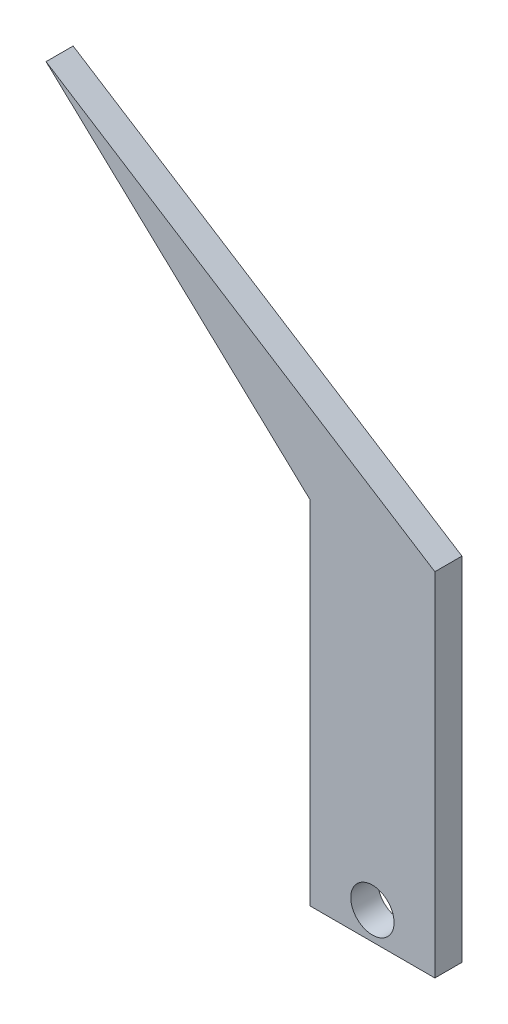
ISO-10303-21;
HEADER;
FILE_DESCRIPTION(('STEP AP214'),'2;1');
FILE_NAME('part.step','',(''),(''),'','','');
FILE_SCHEMA(('AUTOMOTIVE_DESIGN { 1 0 10303 214 1 1 1 1 }'));
ENDSEC;
DATA;
#1=APPLICATION_CONTEXT('core data for automotive mechanical design processes');
#2=APPLICATION_PROTOCOL_DEFINITION('international standard','automotive_design',2000,#1);
#3=PRODUCT_CONTEXT('',#1,'mechanical');
#4=PRODUCT('Part','Part','',(#3));
#5=PRODUCT_RELATED_PRODUCT_CATEGORY('part','',(#4));
#6=PRODUCT_DEFINITION_FORMATION('','',#4);
#7=PRODUCT_DEFINITION_CONTEXT('part definition',#1,'design');
#8=PRODUCT_DEFINITION('design','',#6,#7);
#9=PRODUCT_DEFINITION_SHAPE('','',#8);
#10=(LENGTH_UNIT() NAMED_UNIT(*) SI_UNIT(.MILLI.,.METRE.));
#11=(NAMED_UNIT(*) PLANE_ANGLE_UNIT() SI_UNIT($,.RADIAN.));
#12=(NAMED_UNIT(*) SI_UNIT($,.STERADIAN.) SOLID_ANGLE_UNIT());
#13=UNCERTAINTY_MEASURE_WITH_UNIT(LENGTH_MEASURE(1.E-05),#10,'distance_accuracy_value','');
#14=(GEOMETRIC_REPRESENTATION_CONTEXT(3) GLOBAL_UNCERTAINTY_ASSIGNED_CONTEXT((#13)) GLOBAL_UNIT_ASSIGNED_CONTEXT((#10,
#11,#12)) REPRESENTATION_CONTEXT('',''));
#15=CARTESIAN_POINT('',(0.,0.,0.));
#16=DIRECTION('',(0.,0.,1.));
#17=DIRECTION('',(1.,0.,0.));
#18=AXIS2_PLACEMENT_3D('',#15,#16,#17);
#19=CARTESIAN_POINT('',(23.07,0.,5.));
#20=DIRECTION('',(0.,1.,0.));
#21=DIRECTION('',(-1.,0.,0.));
#22=AXIS2_PLACEMENT_3D('',#19,#20,#21);
#23=PLANE('',#22);
#24=DIRECTION('',(1.,0.,0.));
#25=VECTOR('',#24,1.);
#26=CARTESIAN_POINT('',(23.07,0.,0.));
#27=LINE('',#26,#25);
#28=CARTESIAN_POINT('',(0.,0.,0.));
#29=VERTEX_POINT('',#28);
#30=CARTESIAN_POINT('',(23.07,0.,0.));
#31=VERTEX_POINT('',#30);
#32=EDGE_CURVE('E115',#29,#31,#27,.T.);
#33=ORIENTED_EDGE('',*,*,#32,.T.);
#34=DIRECTION('',(0.,0.,-1.));
#35=VECTOR('',#34,1.);
#36=CARTESIAN_POINT('',(23.07,0.,5.));
#37=LINE('',#36,#35);
#38=CARTESIAN_POINT('',(23.07,0.,5.));
#39=VERTEX_POINT('',#38);
#40=EDGE_CURVE('E11',#39,#31,#37,.T.);
#41=ORIENTED_EDGE('',*,*,#40,.F.);
#42=DIRECTION('',(1.,0.,0.));
#43=VECTOR('',#42,1.);
#44=CARTESIAN_POINT('',(23.07,0.,5.));
#45=LINE('',#44,#43);
#46=CARTESIAN_POINT('',(0.,0.,5.));
#47=VERTEX_POINT('',#46);
#48=EDGE_CURVE('E124',#47,#39,#45,.T.);
#49=ORIENTED_EDGE('',*,*,#48,.F.);
#50=DIRECTION('',(0.,0.,-1.));
#51=VECTOR('',#50,1.);
#52=CARTESIAN_POINT('',(0.,0.,5.));
#53=LINE('',#52,#51);
#54=EDGE_CURVE('E111',#47,#29,#53,.T.);
#55=ORIENTED_EDGE('',*,*,#54,.T.);
#56=EDGE_LOOP('',(#33,#41,#49,#55));
#57=FACE_BOUND('',#56,.T.);
#58=ADVANCED_FACE('F41',(#57),#23,.F.);
#59=CARTESIAN_POINT('',(23.07,65.,5.));
#60=DIRECTION('',(-1.,0.,0.));
#61=DIRECTION('',(0.,-1.,0.));
#62=AXIS2_PLACEMENT_3D('',#59,#60,#61);
#63=PLANE('',#62);
#64=DIRECTION('',(0.,1.,0.));
#65=VECTOR('',#64,1.);
#66=CARTESIAN_POINT('',(23.07,65.,0.));
#67=LINE('',#66,#65);
#68=CARTESIAN_POINT('',(23.07,65.,0.));
#69=VERTEX_POINT('',#68);
#70=EDGE_CURVE('E118',#31,#69,#67,.T.);
#71=ORIENTED_EDGE('',*,*,#70,.T.);
#72=DIRECTION('',(0.,0.,-1.));
#73=VECTOR('',#72,1.);
#74=CARTESIAN_POINT('',(23.07,65.,5.));
#75=LINE('',#74,#73);
#76=CARTESIAN_POINT('',(23.07,65.,5.));
#77=VERTEX_POINT('',#76);
#78=EDGE_CURVE('E49',#77,#69,#75,.T.);
#79=ORIENTED_EDGE('',*,*,#78,.F.);
#80=DIRECTION('',(0.,1.,0.));
#81=VECTOR('',#80,1.);
#82=CARTESIAN_POINT('',(23.07,65.,5.));
#83=LINE('',#82,#81);
#84=EDGE_CURVE('E91',#39,#77,#83,.T.);
#85=ORIENTED_EDGE('',*,*,#84,.F.);
#86=ORIENTED_EDGE('',*,*,#40,.T.);
#87=EDGE_LOOP('',(#71,#79,#85,#86));
#88=FACE_BOUND('',#87,.T.);
#89=ADVANCED_FACE('F145',(#88),#63,.F.);
#90=CARTESIAN_POINT('',(23.07,65.,5.));
#91=DIRECTION('',(-0.536764828913029,-0.843731899623315,0.));
#92=DIRECTION('',(0.843731899623315,-0.536764828913029,0.));
#93=AXIS2_PLACEMENT_3D('',#90,#91,#92);
#94=PLANE('',#93);
#95=DIRECTION('',(-0.843731899623314,0.536764828913029,0.));
#96=VECTOR('',#95,1.);
#97=CARTESIAN_POINT('',(23.07,65.,0.));
#98=LINE('',#97,#96);
#99=CARTESIAN_POINT('',(-48.7554642703694,110.693878657303,0.));
#100=VERTEX_POINT('',#99);
#101=EDGE_CURVE('E106',#69,#100,#98,.T.);
#102=ORIENTED_EDGE('',*,*,#101,.T.);
#103=DIRECTION('',(0.,0.,-1.));
#104=VECTOR('',#103,1.);
#105=CARTESIAN_POINT('',(-48.7554642703694,110.693878657303,5.));
#106=LINE('',#105,#104);
#107=CARTESIAN_POINT('',(-48.7554642703694,110.693878657303,5.));
#108=VERTEX_POINT('',#107);
#109=EDGE_CURVE('E103',#108,#100,#106,.T.);
#110=ORIENTED_EDGE('',*,*,#109,.F.);
#111=DIRECTION('',(-0.843731899623314,0.536764828913029,0.));
#112=VECTOR('',#111,1.);
#113=CARTESIAN_POINT('',(23.07,65.,5.));
#114=LINE('',#113,#112);
#115=EDGE_CURVE('E95',#77,#108,#114,.T.);
#116=ORIENTED_EDGE('',*,*,#115,.F.);
#117=ORIENTED_EDGE('',*,*,#78,.T.);
#118=EDGE_LOOP('',(#102,#110,#116,#117));
#119=FACE_BOUND('',#118,.T.);
#120=ADVANCED_FACE('F104',(#119),#94,.F.);
#121=CARTESIAN_POINT('',(-48.7554642703694,110.693878657303,5.));
#122=DIRECTION('',(0.683826671372972,0.729644491186606,0.));
#123=DIRECTION('',(-0.729644491186606,0.683826671372972,0.));
#124=AXIS2_PLACEMENT_3D('',#121,#122,#123);
#125=PLANE('',#124);
#126=DIRECTION('',(0.729644491186606,-0.683826671372972,0.));
#127=VECTOR('',#126,1.);
#128=CARTESIAN_POINT('',(-48.7554642703694,110.693878657303,0.));
#129=LINE('',#128,#127);
#130=CARTESIAN_POINT('',(0.,65.,0.));
#131=VERTEX_POINT('',#130);
#132=EDGE_CURVE('E77',#100,#131,#129,.T.);
#133=ORIENTED_EDGE('',*,*,#132,.T.);
#134=DIRECTION('',(0.,0.,-1.));
#135=VECTOR('',#134,1.);
#136=CARTESIAN_POINT('',(0.,65.,5.));
#137=LINE('',#136,#135);
#138=CARTESIAN_POINT('',(0.,65.,5.));
#139=VERTEX_POINT('',#138);
#140=EDGE_CURVE('E107',#139,#131,#137,.T.);
#141=ORIENTED_EDGE('',*,*,#140,.F.);
#142=DIRECTION('',(0.729644491186606,-0.683826671372972,0.));
#143=VECTOR('',#142,1.);
#144=CARTESIAN_POINT('',(-48.7554642703694,110.693878657303,5.));
#145=LINE('',#144,#143);
#146=EDGE_CURVE('E99',#108,#139,#145,.T.);
#147=ORIENTED_EDGE('',*,*,#146,.F.);
#148=ORIENTED_EDGE('',*,*,#109,.T.);
#149=EDGE_LOOP('',(#133,#141,#147,#148));
#150=FACE_BOUND('',#149,.T.);
#151=ADVANCED_FACE('F109',(#150),#125,.F.);
#152=CARTESIAN_POINT('',(0.,0.,5.));
#153=DIRECTION('',(1.,0.,0.));
#154=DIRECTION('',(0.,0.,-1.));
#155=AXIS2_PLACEMENT_3D('',#152,#153,#154);
#156=PLANE('',#155);
#157=DIRECTION('',(0.,-1.,0.));
#158=VECTOR('',#157,1.);
#159=CARTESIAN_POINT('',(0.,0.,0.));
#160=LINE('',#159,#158);
#161=EDGE_CURVE('E83',#131,#29,#160,.T.);
#162=ORIENTED_EDGE('',*,*,#161,.T.);
#163=ORIENTED_EDGE('',*,*,#54,.F.);
#164=DIRECTION('',(0.,-1.,0.));
#165=VECTOR('',#164,1.);
#166=CARTESIAN_POINT('',(0.,0.,5.));
#167=LINE('',#166,#165);
#168=EDGE_CURVE('E57',#139,#47,#167,.T.);
#169=ORIENTED_EDGE('',*,*,#168,.F.);
#170=ORIENTED_EDGE('',*,*,#140,.T.);
#171=EDGE_LOOP('',(#162,#163,#169,#170));
#172=FACE_BOUND('',#171,.T.);
#173=ADVANCED_FACE('F132',(#172),#156,.F.);
#174=CARTESIAN_POINT('',(0.,0.,5.));
#175=DIRECTION('',(0.,0.,-1.));
#176=DIRECTION('',(-1.,0.,0.));
#177=AXIS2_PLACEMENT_3D('',#174,#175,#176);
#178=PLANE('',#177);
#179=CARTESIAN_POINT('',(11.535,5.10432051899027,5.));
#180=DIRECTION('',(0.,0.,1.));
#181=DIRECTION('',(1.,0.,0.));
#182=AXIS2_PLACEMENT_3D('',#179,#180,#181);
#183=CIRCLE('',#182,4.);
#184=CARTESIAN_POINT('',(15.535,5.10432051899027,5.));
#185=VERTEX_POINT('',#184);
#186=EDGE_CURVE('E202',#185,#185,#183,.T.);
#187=ORIENTED_EDGE('',*,*,#186,.F.);
#188=EDGE_LOOP('',(#187));
#189=FACE_BOUND('',#188,.T.);
#190=ORIENTED_EDGE('',*,*,#48,.T.);
#191=ORIENTED_EDGE('',*,*,#84,.T.);
#192=ORIENTED_EDGE('',*,*,#115,.T.);
#193=ORIENTED_EDGE('',*,*,#146,.T.);
#194=ORIENTED_EDGE('',*,*,#168,.T.);
#195=EDGE_LOOP('',(#190,#191,#192,#193,#194));
#196=FACE_BOUND('',#195,.T.);
#197=ADVANCED_FACE('F97',(#189,#196),#178,.F.);
#198=CARTESIAN_POINT('',(0.,0.,0.));
#199=DIRECTION('',(0.,0.,-1.));
#200=DIRECTION('',(-1.,0.,0.));
#201=AXIS2_PLACEMENT_3D('',#198,#199,#200);
#202=PLANE('',#201);
#203=CARTESIAN_POINT('',(11.535,5.10432051899027,0.));
#204=DIRECTION('',(0.,0.,1.));
#205=DIRECTION('',(1.,0.,0.));
#206=AXIS2_PLACEMENT_3D('',#203,#204,#205);
#207=CIRCLE('',#206,4.);
#208=CARTESIAN_POINT('',(15.535,5.10432051899027,0.));
#209=VERTEX_POINT('',#208);
#210=EDGE_CURVE('E119',#209,#209,#207,.T.);
#211=ORIENTED_EDGE('',*,*,#210,.T.);
#212=EDGE_LOOP('',(#211));
#213=FACE_BOUND('',#212,.T.);
#214=ORIENTED_EDGE('',*,*,#32,.F.);
#215=ORIENTED_EDGE('',*,*,#161,.F.);
#216=ORIENTED_EDGE('',*,*,#132,.F.);
#217=ORIENTED_EDGE('',*,*,#101,.F.);
#218=ORIENTED_EDGE('',*,*,#70,.F.);
#219=EDGE_LOOP('',(#214,#215,#216,#217,#218));
#220=FACE_BOUND('',#219,.T.);
#221=ADVANCED_FACE('F128',(#213,#220),#202,.T.);
#222=CARTESIAN_POINT('',(11.535,5.10432051899027,0.));
#223=DIRECTION('',(0.,0.,1.));
#224=DIRECTION('',(1.,0.,0.));
#225=AXIS2_PLACEMENT_3D('',#222,#223,#224);
#226=CYLINDRICAL_SURFACE('',#225,4.);
#227=ORIENTED_EDGE('',*,*,#210,.F.);
#228=EDGE_LOOP('',(#227));
#229=FACE_BOUND('',#228,.T.);
#230=ORIENTED_EDGE('',*,*,#186,.T.);
#231=EDGE_LOOP('',(#230));
#232=FACE_BOUND('',#231,.T.);
#233=ADVANCED_FACE('F183',(#229,#232),#226,.F.);
#234=CLOSED_SHELL('',(#58,#89,#120,#151,#173,#197,#221,#233));
#235=MANIFOLD_SOLID_BREP('B2',#234);
#236=ADVANCED_BREP_SHAPE_REPRESENTATION('',(#18,#235),#14);
#237=SHAPE_DEFINITION_REPRESENTATION(#9,#236);
ENDSEC;
END-ISO-10303-21;
